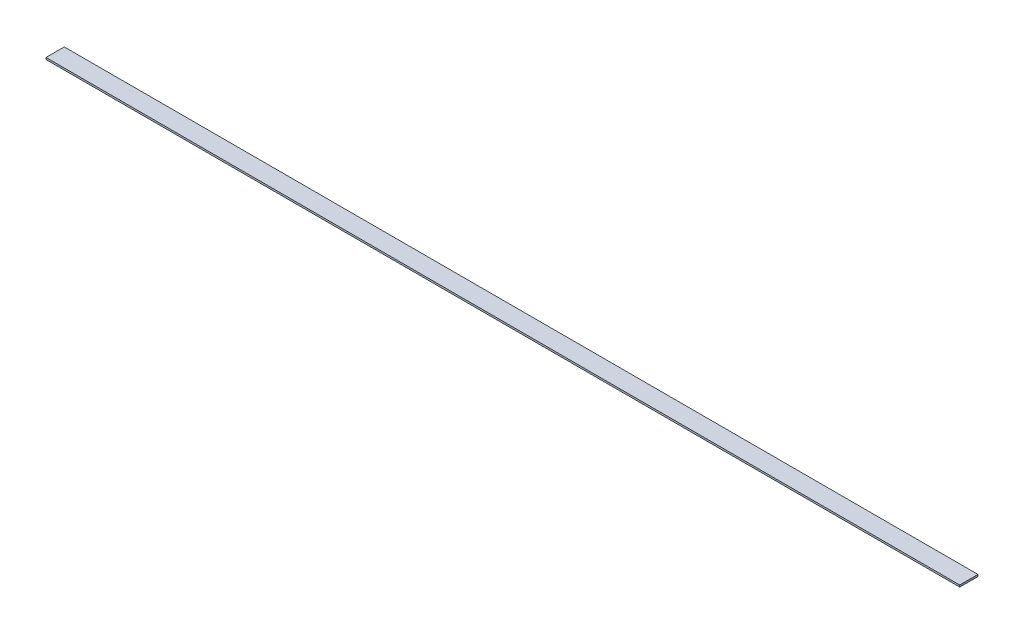
ISO-10303-21;
HEADER;
FILE_DESCRIPTION(('STEP AP214'),'2;1');
FILE_NAME('part.step','',(''),(''),'','','');
FILE_SCHEMA(('AUTOMOTIVE_DESIGN { 1 0 10303 214 1 1 1 1 }'));
ENDSEC;
DATA;
#1=APPLICATION_CONTEXT('core data for automotive mechanical design processes');
#2=APPLICATION_PROTOCOL_DEFINITION('international standard','automotive_design',2000,#1);
#3=PRODUCT_CONTEXT('',#1,'mechanical');
#4=PRODUCT('Part','Part','',(#3));
#5=PRODUCT_RELATED_PRODUCT_CATEGORY('part','',(#4));
#6=PRODUCT_DEFINITION_FORMATION('','',#4);
#7=PRODUCT_DEFINITION_CONTEXT('part definition',#1,'design');
#8=PRODUCT_DEFINITION('design','',#6,#7);
#9=PRODUCT_DEFINITION_SHAPE('','',#8);
#10=(LENGTH_UNIT() NAMED_UNIT(*) SI_UNIT(.MILLI.,.METRE.));
#11=(NAMED_UNIT(*) PLANE_ANGLE_UNIT() SI_UNIT($,.RADIAN.));
#12=(NAMED_UNIT(*) SI_UNIT($,.STERADIAN.) SOLID_ANGLE_UNIT());
#13=UNCERTAINTY_MEASURE_WITH_UNIT(LENGTH_MEASURE(1.E-05),#10,'distance_accuracy_value','');
#14=(GEOMETRIC_REPRESENTATION_CONTEXT(3) GLOBAL_UNCERTAINTY_ASSIGNED_CONTEXT((#13)) GLOBAL_UNIT_ASSIGNED_CONTEXT((#10,
#11,#12)) REPRESENTATION_CONTEXT('',''));
#15=CARTESIAN_POINT('',(0.,0.,0.));
#16=DIRECTION('',(0.,0.,1.));
#17=DIRECTION('',(1.,0.,0.));
#18=AXIS2_PLACEMENT_3D('',#15,#16,#17);
#19=CARTESIAN_POINT('',(0.,0.,1000.));
#20=DIRECTION('',(1.,0.,0.));
#21=DIRECTION('',(0.,0.,-1.));
#22=AXIS2_PLACEMENT_3D('',#19,#20,#21);
#23=PLANE('',#22);
#24=DIRECTION('',(0.,-1.,0.));
#25=VECTOR('',#24,1.);
#26=CARTESIAN_POINT('',(0.,0.,0.));
#27=LINE('',#26,#25);
#28=CARTESIAN_POINT('',(0.,100.,0.));
#29=VERTEX_POINT('',#28);
#30=CARTESIAN_POINT('',(0.,0.,0.));
#31=VERTEX_POINT('',#30);
#32=EDGE_CURVE('E96',#29,#31,#27,.T.);
#33=ORIENTED_EDGE('',*,*,#32,.T.);
#34=DIRECTION('',(0.,0.,-1.));
#35=VECTOR('',#34,1.);
#36=CARTESIAN_POINT('',(0.,0.,1000.));
#37=LINE('',#36,#35);
#38=CARTESIAN_POINT('',(0.,0.,1000.));
#39=VERTEX_POINT('',#38);
#40=EDGE_CURVE('E11',#39,#31,#37,.T.);
#41=ORIENTED_EDGE('',*,*,#40,.F.);
#42=DIRECTION('',(0.,-1.,0.));
#43=VECTOR('',#42,1.);
#44=CARTESIAN_POINT('',(0.,0.,1000.));
#45=LINE('',#44,#43);
#46=CARTESIAN_POINT('',(0.,100.,1000.));
#47=VERTEX_POINT('',#46);
#48=EDGE_CURVE('E84',#47,#39,#45,.T.);
#49=ORIENTED_EDGE('',*,*,#48,.F.);
#50=DIRECTION('',(0.,0.,-1.));
#51=VECTOR('',#50,1.);
#52=CARTESIAN_POINT('',(0.,100.,1000.));
#53=LINE('',#52,#51);
#54=EDGE_CURVE('E92',#47,#29,#53,.T.);
#55=ORIENTED_EDGE('',*,*,#54,.T.);
#56=EDGE_LOOP('',(#33,#41,#49,#55));
#57=FACE_BOUND('',#56,.T.);
#58=ADVANCED_FACE('F33',(#57),#23,.F.);
#59=CARTESIAN_POINT('',(0.,0.,1000.));
#60=DIRECTION('',(0.,1.,0.));
#61=DIRECTION('',(0.,0.,1.));
#62=AXIS2_PLACEMENT_3D('',#59,#60,#61);
#63=PLANE('',#62);
#64=DIRECTION('',(1.,0.,0.));
#65=VECTOR('',#64,1.);
#66=CARTESIAN_POINT('',(0.,0.,0.));
#67=LINE('',#66,#65);
#68=CARTESIAN_POINT('',(50000.,0.,0.));
#69=VERTEX_POINT('',#68);
#70=EDGE_CURVE('E88',#31,#69,#67,.T.);
#71=ORIENTED_EDGE('',*,*,#70,.T.);
#72=DIRECTION('',(0.,0.,-1.));
#73=VECTOR('',#72,1.);
#74=CARTESIAN_POINT('',(50000.,0.,1000.));
#75=LINE('',#74,#73);
#76=CARTESIAN_POINT('',(50000.,0.,1000.));
#77=VERTEX_POINT('',#76);
#78=EDGE_CURVE('E41',#77,#69,#75,.T.);
#79=ORIENTED_EDGE('',*,*,#78,.F.);
#80=DIRECTION('',(1.,0.,0.));
#81=VECTOR('',#80,1.);
#82=CARTESIAN_POINT('',(0.,0.,1000.));
#83=LINE('',#82,#81);
#84=EDGE_CURVE('E79',#39,#77,#83,.T.);
#85=ORIENTED_EDGE('',*,*,#84,.F.);
#86=ORIENTED_EDGE('',*,*,#40,.T.);
#87=EDGE_LOOP('',(#71,#79,#85,#86));
#88=FACE_BOUND('',#87,.T.);
#89=ADVANCED_FACE('F87',(#88),#63,.F.);
#90=CARTESIAN_POINT('',(50000.,0.,1000.));
#91=DIRECTION('',(-1.,0.,0.));
#92=DIRECTION('',(0.,0.,1.));
#93=AXIS2_PLACEMENT_3D('',#90,#91,#92);
#94=PLANE('',#93);
#95=DIRECTION('',(0.,1.,0.));
#96=VECTOR('',#95,1.);
#97=CARTESIAN_POINT('',(50000.,0.,0.));
#98=LINE('',#97,#96);
#99=CARTESIAN_POINT('',(50000.,100.,0.));
#100=VERTEX_POINT('',#99);
#101=EDGE_CURVE('E66',#69,#100,#98,.T.);
#102=ORIENTED_EDGE('',*,*,#101,.T.);
#103=DIRECTION('',(0.,0.,-1.));
#104=VECTOR('',#103,1.);
#105=CARTESIAN_POINT('',(50000.,100.,1000.));
#106=LINE('',#105,#104);
#107=CARTESIAN_POINT('',(50000.,100.,1000.));
#108=VERTEX_POINT('',#107);
#109=EDGE_CURVE('E89',#108,#100,#106,.T.);
#110=ORIENTED_EDGE('',*,*,#109,.F.);
#111=DIRECTION('',(0.,1.,0.));
#112=VECTOR('',#111,1.);
#113=CARTESIAN_POINT('',(50000.,0.,1000.));
#114=LINE('',#113,#112);
#115=EDGE_CURVE('E82',#77,#108,#114,.T.);
#116=ORIENTED_EDGE('',*,*,#115,.F.);
#117=ORIENTED_EDGE('',*,*,#78,.T.);
#118=EDGE_LOOP('',(#102,#110,#116,#117));
#119=FACE_BOUND('',#118,.T.);
#120=ADVANCED_FACE('F90',(#119),#94,.F.);
#121=CARTESIAN_POINT('',(0.,100.,1000.));
#122=DIRECTION('',(0.,-1.,0.));
#123=DIRECTION('',(0.,0.,-1.));
#124=AXIS2_PLACEMENT_3D('',#121,#122,#123);
#125=PLANE('',#124);
#126=DIRECTION('',(-1.,0.,0.));
#127=VECTOR('',#126,1.);
#128=CARTESIAN_POINT('',(0.,100.,0.));
#129=LINE('',#128,#127);
#130=EDGE_CURVE('E72',#100,#29,#129,.T.);
#131=ORIENTED_EDGE('',*,*,#130,.T.);
#132=ORIENTED_EDGE('',*,*,#54,.F.);
#133=DIRECTION('',(-1.,0.,0.));
#134=VECTOR('',#133,1.);
#135=CARTESIAN_POINT('',(0.,100.,1000.));
#136=LINE('',#135,#134);
#137=EDGE_CURVE('E49',#108,#47,#136,.T.);
#138=ORIENTED_EDGE('',*,*,#137,.F.);
#139=ORIENTED_EDGE('',*,*,#109,.T.);
#140=EDGE_LOOP('',(#131,#132,#138,#139));
#141=FACE_BOUND('',#140,.T.);
#142=ADVANCED_FACE('F103',(#141),#125,.F.);
#143=CARTESIAN_POINT('',(0.,0.,1000.));
#144=DIRECTION('',(0.,0.,-1.));
#145=DIRECTION('',(-1.,0.,0.));
#146=AXIS2_PLACEMENT_3D('',#143,#144,#145);
#147=PLANE('',#146);
#148=ORIENTED_EDGE('',*,*,#48,.T.);
#149=ORIENTED_EDGE('',*,*,#84,.T.);
#150=ORIENTED_EDGE('',*,*,#115,.T.);
#151=ORIENTED_EDGE('',*,*,#137,.T.);
#152=EDGE_LOOP('',(#148,#149,#150,#151));
#153=FACE_BOUND('',#152,.T.);
#154=ADVANCED_FACE('F80',(#153),#147,.F.);
#155=CARTESIAN_POINT('',(0.,0.,0.));
#156=DIRECTION('',(0.,0.,-1.));
#157=DIRECTION('',(-1.,0.,0.));
#158=AXIS2_PLACEMENT_3D('',#155,#156,#157);
#159=PLANE('',#158);
#160=ORIENTED_EDGE('',*,*,#32,.F.);
#161=ORIENTED_EDGE('',*,*,#130,.F.);
#162=ORIENTED_EDGE('',*,*,#101,.F.);
#163=ORIENTED_EDGE('',*,*,#70,.F.);
#164=EDGE_LOOP('',(#160,#161,#162,#163));
#165=FACE_BOUND('',#164,.T.);
#166=ADVANCED_FACE('F106',(#165),#159,.T.);
#167=CLOSED_SHELL('',(#58,#89,#120,#142,#154,#166));
#168=MANIFOLD_SOLID_BREP('B2',#167);
#169=ADVANCED_BREP_SHAPE_REPRESENTATION('',(#18,#168),#14);
#170=SHAPE_DEFINITION_REPRESENTATION(#9,#169);
ENDSEC;
END-ISO-10303-21;
